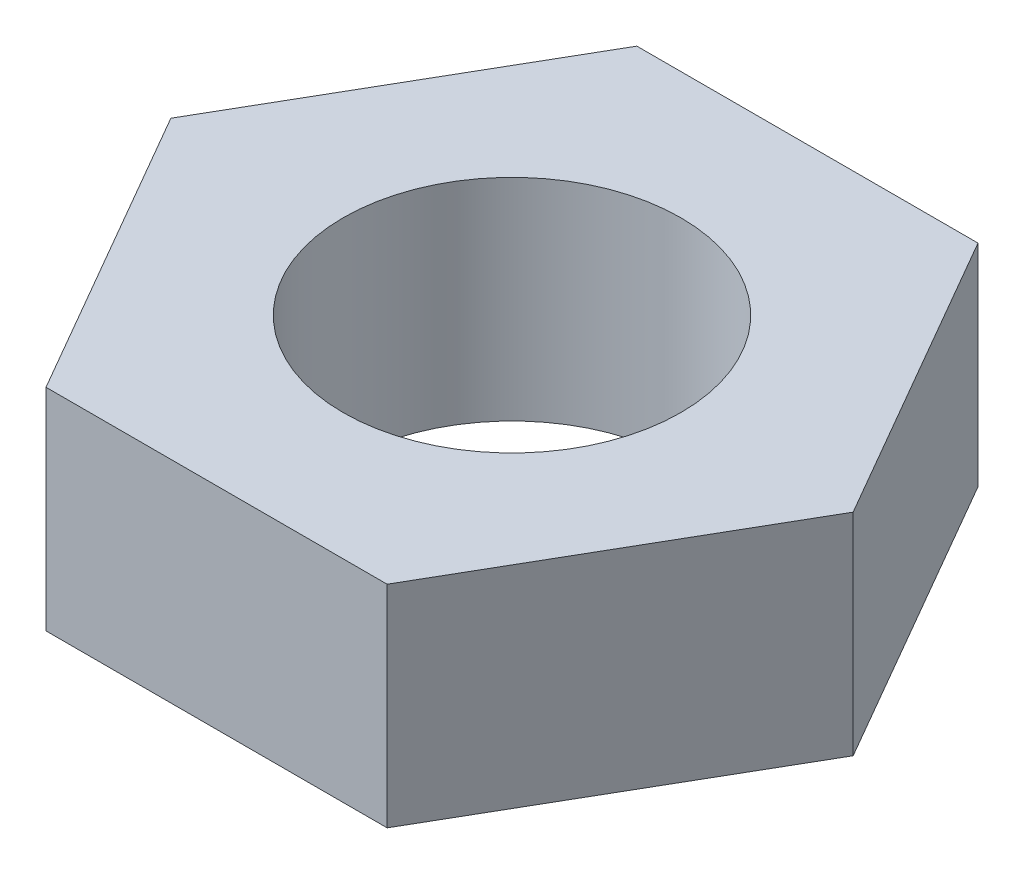
ISO-10303-21;
HEADER;
FILE_DESCRIPTION(('STEP AP214'),'2;1');
FILE_NAME('part.step','',(''),(''),'','','');
FILE_SCHEMA(('AUTOMOTIVE_DESIGN { 1 0 10303 214 1 1 1 1 }'));
ENDSEC;
DATA;
#1=APPLICATION_CONTEXT('core data for automotive mechanical design processes');
#2=APPLICATION_PROTOCOL_DEFINITION('international standard','automotive_design',2000,#1);
#3=PRODUCT_CONTEXT('',#1,'mechanical');
#4=PRODUCT('Part','Part','',(#3));
#5=PRODUCT_RELATED_PRODUCT_CATEGORY('part','',(#4));
#6=PRODUCT_DEFINITION_FORMATION('','',#4);
#7=PRODUCT_DEFINITION_CONTEXT('part definition',#1,'design');
#8=PRODUCT_DEFINITION('design','',#6,#7);
#9=PRODUCT_DEFINITION_SHAPE('','',#8);
#10=(LENGTH_UNIT() NAMED_UNIT(*) SI_UNIT(.MILLI.,.METRE.));
#11=(NAMED_UNIT(*) PLANE_ANGLE_UNIT() SI_UNIT($,.RADIAN.));
#12=(NAMED_UNIT(*) SI_UNIT($,.STERADIAN.) SOLID_ANGLE_UNIT());
#13=UNCERTAINTY_MEASURE_WITH_UNIT(LENGTH_MEASURE(1.E-05),#10,'distance_accuracy_value','');
#14=(GEOMETRIC_REPRESENTATION_CONTEXT(3) GLOBAL_UNCERTAINTY_ASSIGNED_CONTEXT((#13)) GLOBAL_UNIT_ASSIGNED_CONTEXT((#10,
#11,#12)) REPRESENTATION_CONTEXT('',''));
#15=CARTESIAN_POINT('',(0.,0.,0.));
#16=DIRECTION('',(0.,0.,1.));
#17=DIRECTION('',(1.,0.,0.));
#18=AXIS2_PLACEMENT_3D('',#15,#16,#17);
#19=CARTESIAN_POINT('',(6.41580486636971,3.96875,0.));
#20=DIRECTION('',(-0.866025403784438,0.,0.5));
#21=DIRECTION('',(0.5,0.,0.866025403784438));
#22=AXIS2_PLACEMENT_3D('',#19,#20,#21);
#23=PLANE('',#22);
#24=DIRECTION('',(-0.5,0.,-0.866025403784438));
#25=VECTOR('',#24,1.);
#26=CARTESIAN_POINT('',(6.41580486636971,0.,0.));
#27=LINE('',#26,#25);
#28=CARTESIAN_POINT('',(6.41580486636971,0.,0.));
#29=VERTEX_POINT('',#28);
#30=CARTESIAN_POINT('',(3.20790243318485,0.,-5.55625));
#31=VERTEX_POINT('',#30);
#32=EDGE_CURVE('E122',#29,#31,#27,.T.);
#33=ORIENTED_EDGE('',*,*,#32,.T.);
#34=DIRECTION('',(0.,-1.,0.));
#35=VECTOR('',#34,1.);
#36=CARTESIAN_POINT('',(3.20790243318485,3.96875,-5.55625));
#37=LINE('',#36,#35);
#38=CARTESIAN_POINT('',(3.20790243318485,3.96875,-5.55625));
#39=VERTEX_POINT('',#38);
#40=EDGE_CURVE('E11',#39,#31,#37,.T.);
#41=ORIENTED_EDGE('',*,*,#40,.F.);
#42=DIRECTION('',(-0.5,0.,-0.866025403784438));
#43=VECTOR('',#42,1.);
#44=CARTESIAN_POINT('',(6.41580486636971,3.96875,0.));
#45=LINE('',#44,#43);
#46=CARTESIAN_POINT('',(6.41580486636971,3.96875,0.));
#47=VERTEX_POINT('',#46);
#48=EDGE_CURVE('E133',#47,#39,#45,.T.);
#49=ORIENTED_EDGE('',*,*,#48,.F.);
#50=DIRECTION('',(0.,-1.,0.));
#51=VECTOR('',#50,1.);
#52=CARTESIAN_POINT('',(6.41580486636971,3.96875,0.));
#53=LINE('',#52,#51);
#54=EDGE_CURVE('E118',#47,#29,#53,.T.);
#55=ORIENTED_EDGE('',*,*,#54,.T.);
#56=EDGE_LOOP('',(#33,#41,#49,#55));
#57=FACE_BOUND('',#56,.T.);
#58=ADVANCED_FACE('F38',(#57),#23,.F.);
#59=CARTESIAN_POINT('',(3.20790243318485,3.96875,-5.55625));
#60=DIRECTION('',(0.,0.,1.));
#61=DIRECTION('',(1.,0.,0.));
#62=AXIS2_PLACEMENT_3D('',#59,#60,#61);
#63=PLANE('',#62);
#64=DIRECTION('',(-1.,0.,0.));
#65=VECTOR('',#64,1.);
#66=CARTESIAN_POINT('',(3.20790243318485,0.,-5.55625));
#67=LINE('',#66,#65);
#68=CARTESIAN_POINT('',(-3.20790243318486,0.,-5.55625));
#69=VERTEX_POINT('',#68);
#70=EDGE_CURVE('E125',#31,#69,#67,.T.);
#71=ORIENTED_EDGE('',*,*,#70,.T.);
#72=DIRECTION('',(0.,-1.,0.));
#73=VECTOR('',#72,1.);
#74=CARTESIAN_POINT('',(-3.20790243318486,3.96875,-5.55625));
#75=LINE('',#74,#73);
#76=CARTESIAN_POINT('',(-3.20790243318486,3.96875,-5.55625));
#77=VERTEX_POINT('',#76);
#78=EDGE_CURVE('E46',#77,#69,#75,.T.);
#79=ORIENTED_EDGE('',*,*,#78,.F.);
#80=DIRECTION('',(-1.,0.,0.));
#81=VECTOR('',#80,1.);
#82=CARTESIAN_POINT('',(3.20790243318485,3.96875,-5.55625));
#83=LINE('',#82,#81);
#84=EDGE_CURVE('E91',#39,#77,#83,.T.);
#85=ORIENTED_EDGE('',*,*,#84,.F.);
#86=ORIENTED_EDGE('',*,*,#40,.T.);
#87=EDGE_LOOP('',(#71,#79,#85,#86));
#88=FACE_BOUND('',#87,.T.);
#89=ADVANCED_FACE('F158',(#88),#63,.F.);
#90=CARTESIAN_POINT('',(-3.20790243318486,3.96875,-5.55625));
#91=DIRECTION('',(0.866025403784439,0.,0.5));
#92=DIRECTION('',(0.5,0.,-0.866025403784439));
#93=AXIS2_PLACEMENT_3D('',#90,#91,#92);
#94=PLANE('',#93);
#95=DIRECTION('',(-0.5,0.,0.866025403784439));
#96=VECTOR('',#95,1.);
#97=CARTESIAN_POINT('',(-3.20790243318486,0.,-5.55625));
#98=LINE('',#97,#96);
#99=CARTESIAN_POINT('',(-6.41580486636972,0.,0.));
#100=VERTEX_POINT('',#99);
#101=EDGE_CURVE('E128',#69,#100,#98,.T.);
#102=ORIENTED_EDGE('',*,*,#101,.T.);
#103=DIRECTION('',(0.,-1.,0.));
#104=VECTOR('',#103,1.);
#105=CARTESIAN_POINT('',(-6.41580486636972,3.96875,0.));
#106=LINE('',#105,#104);
#107=CARTESIAN_POINT('',(-6.41580486636972,3.96875,0.));
#108=VERTEX_POINT('',#107);
#109=EDGE_CURVE('E113',#108,#100,#106,.T.);
#110=ORIENTED_EDGE('',*,*,#109,.F.);
#111=DIRECTION('',(-0.5,0.,0.866025403784439));
#112=VECTOR('',#111,1.);
#113=CARTESIAN_POINT('',(-3.20790243318486,3.96875,-5.55625));
#114=LINE('',#113,#112);
#115=EDGE_CURVE('E104',#77,#108,#114,.T.);
#116=ORIENTED_EDGE('',*,*,#115,.F.);
#117=ORIENTED_EDGE('',*,*,#78,.T.);
#118=EDGE_LOOP('',(#102,#110,#116,#117));
#119=FACE_BOUND('',#118,.T.);
#120=ADVANCED_FACE('F139',(#119),#94,.F.);
#121=CARTESIAN_POINT('',(-6.41580486636972,3.96875,0.));
#122=DIRECTION('',(0.866025403784438,0.,-0.5));
#123=DIRECTION('',(-0.5,0.,-0.866025403784439));
#124=AXIS2_PLACEMENT_3D('',#121,#122,#123);
#125=PLANE('',#124);
#126=DIRECTION('',(0.5,0.,0.866025403784439));
#127=VECTOR('',#126,1.);
#128=CARTESIAN_POINT('',(-6.41580486636972,0.,0.));
#129=LINE('',#128,#127);
#130=CARTESIAN_POINT('',(-3.20790243318486,0.,5.55625));
#131=VERTEX_POINT('',#130);
#132=EDGE_CURVE('E112',#100,#131,#129,.T.);
#133=ORIENTED_EDGE('',*,*,#132,.T.);
#134=DIRECTION('',(0.,-1.,0.));
#135=VECTOR('',#134,1.);
#136=CARTESIAN_POINT('',(-3.20790243318486,3.96875,5.55625));
#137=LINE('',#136,#135);
#138=CARTESIAN_POINT('',(-3.20790243318486,3.96875,5.55625));
#139=VERTEX_POINT('',#138);
#140=EDGE_CURVE('E109',#139,#131,#137,.T.);
#141=ORIENTED_EDGE('',*,*,#140,.F.);
#142=DIRECTION('',(0.5,0.,0.866025403784439));
#143=VECTOR('',#142,1.);
#144=CARTESIAN_POINT('',(-6.41580486636972,3.96875,0.));
#145=LINE('',#144,#143);
#146=EDGE_CURVE('E98',#108,#139,#145,.T.);
#147=ORIENTED_EDGE('',*,*,#146,.F.);
#148=ORIENTED_EDGE('',*,*,#109,.T.);
#149=EDGE_LOOP('',(#133,#141,#147,#148));
#150=FACE_BOUND('',#149,.T.);
#151=ADVANCED_FACE('F110',(#150),#125,.F.);
#152=CARTESIAN_POINT('',(-3.20790243318486,3.96875,5.55625));
#153=DIRECTION('',(0.,0.,-1.));
#154=DIRECTION('',(-1.,0.,0.));
#155=AXIS2_PLACEMENT_3D('',#152,#153,#154);
#156=PLANE('',#155);
#157=DIRECTION('',(1.,0.,0.));
#158=VECTOR('',#157,1.);
#159=CARTESIAN_POINT('',(-3.20790243318486,0.,5.55625));
#160=LINE('',#159,#158);
#161=CARTESIAN_POINT('',(3.20790243318485,0.,5.55625));
#162=VERTEX_POINT('',#161);
#163=EDGE_CURVE('E77',#131,#162,#160,.T.);
#164=ORIENTED_EDGE('',*,*,#163,.T.);
#165=DIRECTION('',(0.,-1.,0.));
#166=VECTOR('',#165,1.);
#167=CARTESIAN_POINT('',(3.20790243318485,3.96875,5.55625));
#168=LINE('',#167,#166);
#169=CARTESIAN_POINT('',(3.20790243318485,3.96875,5.55625));
#170=VERTEX_POINT('',#169);
#171=EDGE_CURVE('E114',#170,#162,#168,.T.);
#172=ORIENTED_EDGE('',*,*,#171,.F.);
#173=DIRECTION('',(1.,0.,0.));
#174=VECTOR('',#173,1.);
#175=CARTESIAN_POINT('',(-3.20790243318486,3.96875,5.55625));
#176=LINE('',#175,#174);
#177=EDGE_CURVE('E102',#139,#170,#176,.T.);
#178=ORIENTED_EDGE('',*,*,#177,.F.);
#179=ORIENTED_EDGE('',*,*,#140,.T.);
#180=EDGE_LOOP('',(#164,#172,#178,#179));
#181=FACE_BOUND('',#180,.T.);
#182=ADVANCED_FACE('F116',(#181),#156,.F.);
#183=CARTESIAN_POINT('',(3.20790243318485,3.96875,5.55625));
#184=DIRECTION('',(-0.866025403784438,0.,-0.5));
#185=DIRECTION('',(-0.5,0.,0.866025403784439));
#186=AXIS2_PLACEMENT_3D('',#183,#184,#185);
#187=PLANE('',#186);
#188=DIRECTION('',(0.5,0.,-0.866025403784438));
#189=VECTOR('',#188,1.);
#190=CARTESIAN_POINT('',(3.20790243318485,0.,5.55625));
#191=LINE('',#190,#189);
#192=EDGE_CURVE('E83',#162,#29,#191,.T.);
#193=ORIENTED_EDGE('',*,*,#192,.T.);
#194=ORIENTED_EDGE('',*,*,#54,.F.);
#195=DIRECTION('',(0.5,0.,-0.866025403784438));
#196=VECTOR('',#195,1.);
#197=CARTESIAN_POINT('',(3.20790243318485,3.96875,5.55625));
#198=LINE('',#197,#196);
#199=EDGE_CURVE('E54',#170,#47,#198,.T.);
#200=ORIENTED_EDGE('',*,*,#199,.F.);
#201=ORIENTED_EDGE('',*,*,#171,.T.);
#202=EDGE_LOOP('',(#193,#194,#200,#201));
#203=FACE_BOUND('',#202,.T.);
#204=ADVANCED_FACE('F146',(#203),#187,.F.);
#205=CARTESIAN_POINT('',(0.,3.96875,0.));
#206=DIRECTION('',(0.,1.,0.));
#207=DIRECTION('',(0.,0.,1.));
#208=AXIS2_PLACEMENT_3D('',#205,#206,#207);
#209=PLANE('',#208);
#210=CARTESIAN_POINT('',(0.,3.96875,0.));
#211=DIRECTION('',(0.,1.,0.));
#212=DIRECTION('',(0.,0.,1.));
#213=AXIS2_PLACEMENT_3D('',#210,#211,#212);
#214=CIRCLE('',#213,3.175);
#215=CARTESIAN_POINT('',(0.,3.96875,3.175));
#216=VERTEX_POINT('',#215);
#217=EDGE_CURVE('E218',#216,#216,#214,.T.);
#218=ORIENTED_EDGE('',*,*,#217,.F.);
#219=EDGE_LOOP('',(#218));
#220=FACE_BOUND('',#219,.T.);
#221=ORIENTED_EDGE('',*,*,#48,.T.);
#222=ORIENTED_EDGE('',*,*,#84,.T.);
#223=ORIENTED_EDGE('',*,*,#115,.T.);
#224=ORIENTED_EDGE('',*,*,#146,.T.);
#225=ORIENTED_EDGE('',*,*,#177,.T.);
#226=ORIENTED_EDGE('',*,*,#199,.T.);
#227=EDGE_LOOP('',(#221,#222,#223,#224,#225,#226));
#228=FACE_BOUND('',#227,.T.);
#229=ADVANCED_FACE('F100',(#220,#228),#209,.T.);
#230=CARTESIAN_POINT('',(0.,0.,0.));
#231=DIRECTION('',(0.,1.,0.));
#232=DIRECTION('',(0.,0.,1.));
#233=AXIS2_PLACEMENT_3D('',#230,#231,#232);
#234=PLANE('',#233);
#235=CARTESIAN_POINT('',(0.,0.,0.));
#236=DIRECTION('',(0.,1.,0.));
#237=DIRECTION('',(0.,0.,1.));
#238=AXIS2_PLACEMENT_3D('',#235,#236,#237);
#239=CIRCLE('',#238,3.175);
#240=CARTESIAN_POINT('',(0.,0.,3.175));
#241=VERTEX_POINT('',#240);
#242=EDGE_CURVE('E126',#241,#241,#239,.T.);
#243=ORIENTED_EDGE('',*,*,#242,.T.);
#244=EDGE_LOOP('',(#243));
#245=FACE_BOUND('',#244,.T.);
#246=ORIENTED_EDGE('',*,*,#32,.F.);
#247=ORIENTED_EDGE('',*,*,#192,.F.);
#248=ORIENTED_EDGE('',*,*,#163,.F.);
#249=ORIENTED_EDGE('',*,*,#132,.F.);
#250=ORIENTED_EDGE('',*,*,#101,.F.);
#251=ORIENTED_EDGE('',*,*,#70,.F.);
#252=EDGE_LOOP('',(#246,#247,#248,#249,#250,#251));
#253=FACE_BOUND('',#252,.T.);
#254=ADVANCED_FACE('F142',(#245,#253),#234,.F.);
#255=CARTESIAN_POINT('',(0.,0.,0.));
#256=DIRECTION('',(0.,1.,0.));
#257=DIRECTION('',(0.,0.,1.));
#258=AXIS2_PLACEMENT_3D('',#255,#256,#257);
#259=CYLINDRICAL_SURFACE('',#258,3.175);
#260=ORIENTED_EDGE('',*,*,#242,.F.);
#261=EDGE_LOOP('',(#260));
#262=FACE_BOUND('',#261,.T.);
#263=ORIENTED_EDGE('',*,*,#217,.T.);
#264=EDGE_LOOP('',(#263));
#265=FACE_BOUND('',#264,.T.);
#266=ADVANCED_FACE('F197',(#262,#265),#259,.F.);
#267=CLOSED_SHELL('',(#58,#89,#120,#151,#182,#204,#229,#254,#266));
#268=MANIFOLD_SOLID_BREP('B2',#267);
#269=ADVANCED_BREP_SHAPE_REPRESENTATION('',(#18,#268),#14);
#270=SHAPE_DEFINITION_REPRESENTATION(#9,#269);
ENDSEC;
END-ISO-10303-21;
